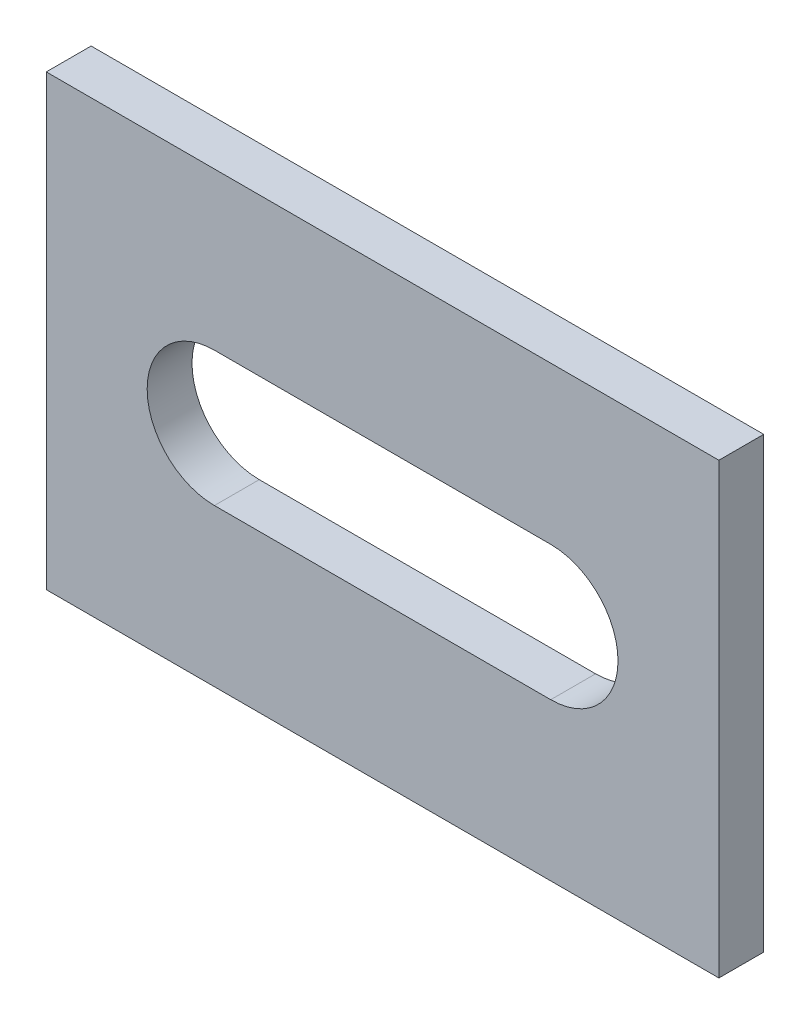
ISO-10303-21;
HEADER;
FILE_DESCRIPTION(('STEP AP214'),'2;1');
FILE_NAME('part.step','',(''),(''),'','','');
FILE_SCHEMA(('AUTOMOTIVE_DESIGN { 1 0 10303 214 1 1 1 1 }'));
ENDSEC;
DATA;
#1=APPLICATION_CONTEXT('core data for automotive mechanical design processes');
#2=APPLICATION_PROTOCOL_DEFINITION('international standard','automotive_design',2000,#1);
#3=PRODUCT_CONTEXT('',#1,'mechanical');
#4=PRODUCT('Part','Part','',(#3));
#5=PRODUCT_RELATED_PRODUCT_CATEGORY('part','',(#4));
#6=PRODUCT_DEFINITION_FORMATION('','',#4);
#7=PRODUCT_DEFINITION_CONTEXT('part definition',#1,'design');
#8=PRODUCT_DEFINITION('design','',#6,#7);
#9=PRODUCT_DEFINITION_SHAPE('','',#8);
#10=(LENGTH_UNIT() NAMED_UNIT(*) SI_UNIT(.MILLI.,.METRE.));
#11=(NAMED_UNIT(*) PLANE_ANGLE_UNIT() SI_UNIT($,.RADIAN.));
#12=(NAMED_UNIT(*) SI_UNIT($,.STERADIAN.) SOLID_ANGLE_UNIT());
#13=UNCERTAINTY_MEASURE_WITH_UNIT(LENGTH_MEASURE(1.E-05),#10,'distance_accuracy_value','');
#14=(GEOMETRIC_REPRESENTATION_CONTEXT(3) GLOBAL_UNCERTAINTY_ASSIGNED_CONTEXT((#13)) GLOBAL_UNIT_ASSIGNED_CONTEXT((#10,
#11,#12)) REPRESENTATION_CONTEXT('',''));
#15=CARTESIAN_POINT('',(0.,0.,0.));
#16=DIRECTION('',(0.,0.,1.));
#17=DIRECTION('',(1.,0.,0.));
#18=AXIS2_PLACEMENT_3D('',#15,#16,#17);
#19=CARTESIAN_POINT('',(0.,0.,2.));
#20=DIRECTION('',(0.,0.,1.));
#21=DIRECTION('',(1.,0.,0.));
#22=AXIS2_PLACEMENT_3D('',#19,#20,#21);
#23=PLANE('',#22);
#24=DIRECTION('',(0.,1.,0.));
#25=VECTOR('',#24,1.);
#26=CARTESIAN_POINT('',(15.,10.,2.));
#27=LINE('',#26,#25);
#28=CARTESIAN_POINT('',(15.,-10.,2.));
#29=VERTEX_POINT('',#28);
#30=CARTESIAN_POINT('',(15.,10.,2.));
#31=VERTEX_POINT('',#30);
#32=EDGE_CURVE('E134',#29,#31,#27,.T.);
#33=ORIENTED_EDGE('',*,*,#32,.T.);
#34=DIRECTION('',(-1.,0.,0.));
#35=VECTOR('',#34,1.);
#36=CARTESIAN_POINT('',(-15.,10.,2.));
#37=LINE('',#36,#35);
#38=CARTESIAN_POINT('',(-15.,10.,2.));
#39=VERTEX_POINT('',#38);
#40=EDGE_CURVE('E137',#31,#39,#37,.T.);
#41=ORIENTED_EDGE('',*,*,#40,.T.);
#42=DIRECTION('',(0.,-1.,0.));
#43=VECTOR('',#42,1.);
#44=CARTESIAN_POINT('',(-15.,10.,2.));
#45=LINE('',#44,#43);
#46=CARTESIAN_POINT('',(-15.,-10.,2.));
#47=VERTEX_POINT('',#46);
#48=EDGE_CURVE('E140',#39,#47,#45,.T.);
#49=ORIENTED_EDGE('',*,*,#48,.T.);
#50=DIRECTION('',(1.,0.,0.));
#51=VECTOR('',#50,1.);
#52=CARTESIAN_POINT('',(-15.,-10.,2.));
#53=LINE('',#52,#51);
#54=EDGE_CURVE('E142',#47,#29,#53,.T.);
#55=ORIENTED_EDGE('',*,*,#54,.T.);
#56=EDGE_LOOP('',(#33,#41,#49,#55));
#57=FACE_BOUND('',#56,.T.);
#58=DIRECTION('',(1.,0.,0.));
#59=VECTOR('',#58,1.);
#60=CARTESIAN_POINT('',(-7.5,-3.,2.));
#61=LINE('',#60,#59);
#62=CARTESIAN_POINT('',(-7.5,-3.,2.));
#63=VERTEX_POINT('',#62);
#64=CARTESIAN_POINT('',(7.5,-3.,2.));
#65=VERTEX_POINT('',#64);
#66=EDGE_CURVE('E106',#63,#65,#61,.T.);
#67=ORIENTED_EDGE('',*,*,#66,.F.);
#68=CARTESIAN_POINT('',(-7.5,0.,2.));
#69=DIRECTION('',(0.,0.,1.));
#70=DIRECTION('',(1.,0.,0.));
#71=AXIS2_PLACEMENT_3D('',#68,#69,#70);
#72=CIRCLE('',#71,3.);
#73=CARTESIAN_POINT('',(-7.5,3.,2.));
#74=VERTEX_POINT('',#73);
#75=EDGE_CURVE('E98',#74,#63,#72,.T.);
#76=ORIENTED_EDGE('',*,*,#75,.F.);
#77=DIRECTION('',(-1.,0.,0.));
#78=VECTOR('',#77,1.);
#79=CARTESIAN_POINT('',(-7.5,3.,2.));
#80=LINE('',#79,#78);
#81=CARTESIAN_POINT('',(7.5,3.,2.));
#82=VERTEX_POINT('',#81);
#83=EDGE_CURVE('E120',#82,#74,#80,.T.);
#84=ORIENTED_EDGE('',*,*,#83,.F.);
#85=CARTESIAN_POINT('',(7.5,0.,2.));
#86=DIRECTION('',(0.,0.,1.));
#87=DIRECTION('',(1.,0.,0.));
#88=AXIS2_PLACEMENT_3D('',#85,#86,#87);
#89=CIRCLE('',#88,3.);
#90=EDGE_CURVE('E118',#65,#82,#89,.T.);
#91=ORIENTED_EDGE('',*,*,#90,.F.);
#92=EDGE_LOOP('',(#67,#76,#84,#91));
#93=FACE_BOUND('',#92,.T.);
#94=ADVANCED_FACE('F33',(#57,#93),#23,.T.);
#95=CARTESIAN_POINT('',(0.,0.,0.));
#96=DIRECTION('',(0.,0.,1.));
#97=DIRECTION('',(1.,0.,0.));
#98=AXIS2_PLACEMENT_3D('',#95,#96,#97);
#99=PLANE('',#98);
#100=DIRECTION('',(0.,1.,0.));
#101=VECTOR('',#100,1.);
#102=CARTESIAN_POINT('',(15.,10.,0.));
#103=LINE('',#102,#101);
#104=CARTESIAN_POINT('',(15.,-10.,0.));
#105=VERTEX_POINT('',#104);
#106=CARTESIAN_POINT('',(15.,10.,0.));
#107=VERTEX_POINT('',#106);
#108=EDGE_CURVE('E114',#105,#107,#103,.T.);
#109=ORIENTED_EDGE('',*,*,#108,.F.);
#110=DIRECTION('',(1.,0.,0.));
#111=VECTOR('',#110,1.);
#112=CARTESIAN_POINT('',(-15.,-10.,0.));
#113=LINE('',#112,#111);
#114=CARTESIAN_POINT('',(-15.,-10.,0.));
#115=VERTEX_POINT('',#114);
#116=EDGE_CURVE('E138',#115,#105,#113,.T.);
#117=ORIENTED_EDGE('',*,*,#116,.F.);
#118=DIRECTION('',(0.,-1.,0.));
#119=VECTOR('',#118,1.);
#120=CARTESIAN_POINT('',(-15.,10.,0.));
#121=LINE('',#120,#119);
#122=CARTESIAN_POINT('',(-15.,10.,0.));
#123=VERTEX_POINT('',#122);
#124=EDGE_CURVE('E149',#123,#115,#121,.T.);
#125=ORIENTED_EDGE('',*,*,#124,.F.);
#126=DIRECTION('',(-1.,0.,0.));
#127=VECTOR('',#126,1.);
#128=CARTESIAN_POINT('',(-15.,10.,0.));
#129=LINE('',#128,#127);
#130=EDGE_CURVE('E147',#107,#123,#129,.T.);
#131=ORIENTED_EDGE('',*,*,#130,.F.);
#132=EDGE_LOOP('',(#109,#117,#125,#131));
#133=FACE_BOUND('',#132,.T.);
#134=CARTESIAN_POINT('',(-7.5,0.,0.));
#135=DIRECTION('',(0.,0.,1.));
#136=DIRECTION('',(1.,0.,0.));
#137=AXIS2_PLACEMENT_3D('',#134,#135,#136);
#138=CIRCLE('',#137,3.);
#139=CARTESIAN_POINT('',(-7.5,3.,0.));
#140=VERTEX_POINT('',#139);
#141=CARTESIAN_POINT('',(-7.5,-3.,0.));
#142=VERTEX_POINT('',#141);
#143=EDGE_CURVE('E56',#140,#142,#138,.T.);
#144=ORIENTED_EDGE('',*,*,#143,.T.);
#145=DIRECTION('',(1.,0.,0.));
#146=VECTOR('',#145,1.);
#147=CARTESIAN_POINT('',(-7.5,-3.,0.));
#148=LINE('',#147,#146);
#149=CARTESIAN_POINT('',(7.5,-3.,0.));
#150=VERTEX_POINT('',#149);
#151=EDGE_CURVE('E113',#142,#150,#148,.T.);
#152=ORIENTED_EDGE('',*,*,#151,.T.);
#153=CARTESIAN_POINT('',(7.5,0.,0.));
#154=DIRECTION('',(0.,0.,1.));
#155=DIRECTION('',(1.,0.,0.));
#156=AXIS2_PLACEMENT_3D('',#153,#154,#155);
#157=CIRCLE('',#156,3.);
#158=CARTESIAN_POINT('',(7.5,3.,0.));
#159=VERTEX_POINT('',#158);
#160=EDGE_CURVE('E126',#150,#159,#157,.T.);
#161=ORIENTED_EDGE('',*,*,#160,.T.);
#162=DIRECTION('',(-1.,0.,0.));
#163=VECTOR('',#162,1.);
#164=CARTESIAN_POINT('',(-7.5,3.,0.));
#165=LINE('',#164,#163);
#166=EDGE_CURVE('E107',#159,#140,#165,.T.);
#167=ORIENTED_EDGE('',*,*,#166,.T.);
#168=EDGE_LOOP('',(#144,#152,#161,#167));
#169=FACE_BOUND('',#168,.T.);
#170=ADVANCED_FACE('F167',(#133,#169),#99,.F.);
#171=CARTESIAN_POINT('',(15.,10.,2.));
#172=DIRECTION('',(-1.,0.,0.));
#173=DIRECTION('',(0.,-1.,0.));
#174=AXIS2_PLACEMENT_3D('',#171,#172,#173);
#175=PLANE('',#174);
#176=ORIENTED_EDGE('',*,*,#108,.T.);
#177=DIRECTION('',(0.,0.,-1.));
#178=VECTOR('',#177,1.);
#179=CARTESIAN_POINT('',(15.,10.,2.));
#180=LINE('',#179,#178);
#181=EDGE_CURVE('E11',#31,#107,#180,.T.);
#182=ORIENTED_EDGE('',*,*,#181,.F.);
#183=ORIENTED_EDGE('',*,*,#32,.F.);
#184=DIRECTION('',(0.,0.,-1.));
#185=VECTOR('',#184,1.);
#186=CARTESIAN_POINT('',(15.,-10.,2.));
#187=LINE('',#186,#185);
#188=EDGE_CURVE('E144',#29,#105,#187,.T.);
#189=ORIENTED_EDGE('',*,*,#188,.T.);
#190=EDGE_LOOP('',(#176,#182,#183,#189));
#191=FACE_BOUND('',#190,.T.);
#192=ADVANCED_FACE('F35',(#191),#175,.F.);
#193=CARTESIAN_POINT('',(-15.,10.,2.));
#194=DIRECTION('',(0.,-1.,0.));
#195=DIRECTION('',(0.,0.,-1.));
#196=AXIS2_PLACEMENT_3D('',#193,#194,#195);
#197=PLANE('',#196);
#198=ORIENTED_EDGE('',*,*,#130,.T.);
#199=DIRECTION('',(0.,0.,-1.));
#200=VECTOR('',#199,1.);
#201=CARTESIAN_POINT('',(-15.,10.,2.));
#202=LINE('',#201,#200);
#203=EDGE_CURVE('E41',#39,#123,#202,.T.);
#204=ORIENTED_EDGE('',*,*,#203,.F.);
#205=ORIENTED_EDGE('',*,*,#40,.F.);
#206=ORIENTED_EDGE('',*,*,#181,.T.);
#207=EDGE_LOOP('',(#198,#204,#205,#206));
#208=FACE_BOUND('',#207,.T.);
#209=ADVANCED_FACE('F177',(#208),#197,.F.);
#210=CARTESIAN_POINT('',(-15.,10.,2.));
#211=DIRECTION('',(1.,0.,0.));
#212=DIRECTION('',(0.,1.,0.));
#213=AXIS2_PLACEMENT_3D('',#210,#211,#212);
#214=PLANE('',#213);
#215=ORIENTED_EDGE('',*,*,#124,.T.);
#216=DIRECTION('',(0.,0.,-1.));
#217=VECTOR('',#216,1.);
#218=CARTESIAN_POINT('',(-15.,-10.,2.));
#219=LINE('',#218,#217);
#220=EDGE_CURVE('E154',#47,#115,#219,.T.);
#221=ORIENTED_EDGE('',*,*,#220,.F.);
#222=ORIENTED_EDGE('',*,*,#48,.F.);
#223=ORIENTED_EDGE('',*,*,#203,.T.);
#224=EDGE_LOOP('',(#215,#221,#222,#223));
#225=FACE_BOUND('',#224,.T.);
#226=ADVANCED_FACE('F161',(#225),#214,.F.);
#227=CARTESIAN_POINT('',(-15.,-10.,2.));
#228=DIRECTION('',(0.,1.,0.));
#229=DIRECTION('',(0.,0.,1.));
#230=AXIS2_PLACEMENT_3D('',#227,#228,#229);
#231=PLANE('',#230);
#232=ORIENTED_EDGE('',*,*,#116,.T.);
#233=ORIENTED_EDGE('',*,*,#188,.F.);
#234=ORIENTED_EDGE('',*,*,#54,.F.);
#235=ORIENTED_EDGE('',*,*,#220,.T.);
#236=EDGE_LOOP('',(#232,#233,#234,#235));
#237=FACE_BOUND('',#236,.T.);
#238=ADVANCED_FACE('F171',(#237),#231,.F.);
#239=CARTESIAN_POINT('',(-7.5,0.,2.));
#240=DIRECTION('',(0.,0.,-1.));
#241=DIRECTION('',(-1.,0.,0.));
#242=AXIS2_PLACEMENT_3D('',#239,#240,#241);
#243=CYLINDRICAL_SURFACE('',#242,3.);
#244=ORIENTED_EDGE('',*,*,#143,.F.);
#245=DIRECTION('',(0.,0.,-1.));
#246=VECTOR('',#245,1.);
#247=CARTESIAN_POINT('',(-7.5,3.,2.));
#248=LINE('',#247,#246);
#249=EDGE_CURVE('E102',#74,#140,#248,.T.);
#250=ORIENTED_EDGE('',*,*,#249,.F.);
#251=ORIENTED_EDGE('',*,*,#75,.T.);
#252=DIRECTION('',(0.,0.,-1.));
#253=VECTOR('',#252,1.);
#254=CARTESIAN_POINT('',(-7.5,-3.,2.));
#255=LINE('',#254,#253);
#256=EDGE_CURVE('E101',#63,#142,#255,.T.);
#257=ORIENTED_EDGE('',*,*,#256,.T.);
#258=EDGE_LOOP('',(#244,#250,#251,#257));
#259=FACE_BOUND('',#258,.T.);
#260=ADVANCED_FACE('F100',(#259),#243,.F.);
#261=CARTESIAN_POINT('',(-7.5,-3.,2.));
#262=DIRECTION('',(0.,1.,0.));
#263=DIRECTION('',(0.,0.,1.));
#264=AXIS2_PLACEMENT_3D('',#261,#262,#263);
#265=PLANE('',#264);
#266=ORIENTED_EDGE('',*,*,#151,.F.);
#267=ORIENTED_EDGE('',*,*,#256,.F.);
#268=ORIENTED_EDGE('',*,*,#66,.T.);
#269=DIRECTION('',(0.,0.,-1.));
#270=VECTOR('',#269,1.);
#271=CARTESIAN_POINT('',(7.5,-3.,2.));
#272=LINE('',#271,#270);
#273=EDGE_CURVE('E115',#65,#150,#272,.T.);
#274=ORIENTED_EDGE('',*,*,#273,.T.);
#275=EDGE_LOOP('',(#266,#267,#268,#274));
#276=FACE_BOUND('',#275,.T.);
#277=ADVANCED_FACE('F110',(#276),#265,.T.);
#278=CARTESIAN_POINT('',(7.5,0.,2.));
#279=DIRECTION('',(0.,0.,-1.));
#280=DIRECTION('',(-1.,0.,0.));
#281=AXIS2_PLACEMENT_3D('',#278,#279,#280);
#282=CYLINDRICAL_SURFACE('',#281,3.);
#283=ORIENTED_EDGE('',*,*,#160,.F.);
#284=ORIENTED_EDGE('',*,*,#273,.F.);
#285=ORIENTED_EDGE('',*,*,#90,.T.);
#286=DIRECTION('',(0.,0.,-1.));
#287=VECTOR('',#286,1.);
#288=CARTESIAN_POINT('',(7.5,3.,2.));
#289=LINE('',#288,#287);
#290=EDGE_CURVE('E48',#82,#159,#289,.T.);
#291=ORIENTED_EDGE('',*,*,#290,.T.);
#292=EDGE_LOOP('',(#283,#284,#285,#291));
#293=FACE_BOUND('',#292,.T.);
#294=ADVANCED_FACE('F200',(#293),#282,.F.);
#295=CARTESIAN_POINT('',(-7.5,3.,2.));
#296=DIRECTION('',(0.,-1.,0.));
#297=DIRECTION('',(0.,0.,-1.));
#298=AXIS2_PLACEMENT_3D('',#295,#296,#297);
#299=PLANE('',#298);
#300=ORIENTED_EDGE('',*,*,#166,.F.);
#301=ORIENTED_EDGE('',*,*,#290,.F.);
#302=ORIENTED_EDGE('',*,*,#83,.T.);
#303=ORIENTED_EDGE('',*,*,#249,.T.);
#304=EDGE_LOOP('',(#300,#301,#302,#303));
#305=FACE_BOUND('',#304,.T.);
#306=ADVANCED_FACE('F204',(#305),#299,.T.);
#307=CLOSED_SHELL('',(#94,#170,#192,#209,#226,#238,#260,#277,#294,#306));
#308=MANIFOLD_SOLID_BREP('B2',#307);
#309=ADVANCED_BREP_SHAPE_REPRESENTATION('',(#18,#308),#14);
#310=SHAPE_DEFINITION_REPRESENTATION(#9,#309);
ENDSEC;
END-ISO-10303-21;
